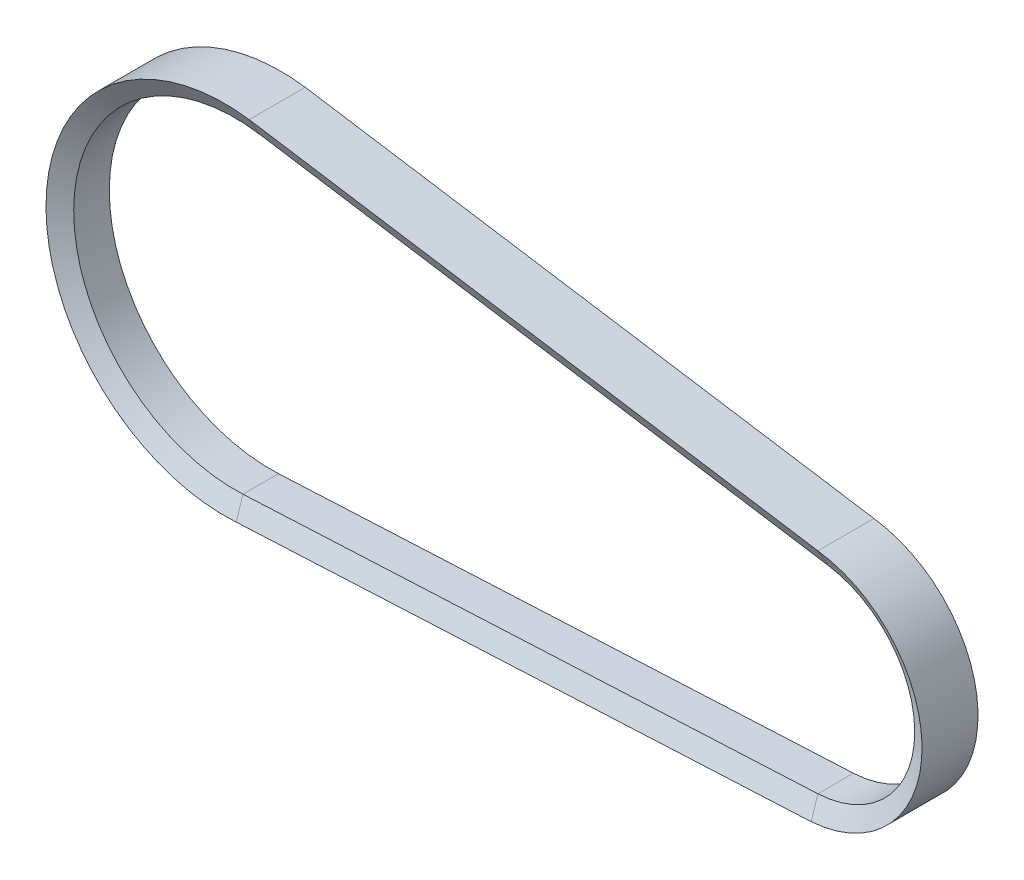
ISO-10303-21;
HEADER;
FILE_DESCRIPTION(('STEP AP214'),'2;1');
FILE_NAME('part.step','',(''),(''),'','','');
FILE_SCHEMA(('AUTOMOTIVE_DESIGN { 1 0 10303 214 1 1 1 1 }'));
ENDSEC;
DATA;
#1=APPLICATION_CONTEXT('core data for automotive mechanical design processes');
#2=APPLICATION_PROTOCOL_DEFINITION('international standard','automotive_design',2000,#1);
#3=PRODUCT_CONTEXT('',#1,'mechanical');
#4=PRODUCT('Part','Part','',(#3));
#5=PRODUCT_RELATED_PRODUCT_CATEGORY('part','',(#4));
#6=PRODUCT_DEFINITION_FORMATION('','',#4);
#7=PRODUCT_DEFINITION_CONTEXT('part definition',#1,'design');
#8=PRODUCT_DEFINITION('design','',#6,#7);
#9=PRODUCT_DEFINITION_SHAPE('','',#8);
#10=(LENGTH_UNIT() NAMED_UNIT(*) SI_UNIT(.MILLI.,.METRE.));
#11=(NAMED_UNIT(*) PLANE_ANGLE_UNIT() SI_UNIT($,.RADIAN.));
#12=(NAMED_UNIT(*) SI_UNIT($,.STERADIAN.) SOLID_ANGLE_UNIT());
#13=UNCERTAINTY_MEASURE_WITH_UNIT(LENGTH_MEASURE(1.E-05),#10,'distance_accuracy_value','');
#14=(GEOMETRIC_REPRESENTATION_CONTEXT(3) GLOBAL_UNCERTAINTY_ASSIGNED_CONTEXT((#13)) GLOBAL_UNIT_ASSIGNED_CONTEXT((#10,
#11,#12)) REPRESENTATION_CONTEXT('',''));
#15=CARTESIAN_POINT('',(0.,0.,0.));
#16=DIRECTION('',(0.,0.,1.));
#17=DIRECTION('',(1.,0.,0.));
#18=AXIS2_PLACEMENT_3D('',#15,#16,#17);
#19=CARTESIAN_POINT('',(0.,0.,0.));
#20=DIRECTION('',(0.,0.,-1.));
#21=DIRECTION('',(-1.,0.,0.));
#22=AXIS2_PLACEMENT_3D('',#19,#20,#21);
#23=CYLINDRICAL_SURFACE('',#22,54.6431790354136);
#24=DIRECTION('',(0.,0.,-1.));
#25=VECTOR('',#24,1.);
#26=CARTESIAN_POINT('',(2.76207245398682,-54.5733265511201,6.035));
#27=LINE('',#26,#25);
#28=CARTESIAN_POINT('',(2.76207245398682,-54.5733265511201,6.035));
#29=VERTEX_POINT('',#28);
#30=CARTESIAN_POINT('',(2.76207245398682,-54.5733265511201,-6.035));
#31=VERTEX_POINT('',#30);
#32=EDGE_CURVE('E219',#29,#31,#27,.T.);
#33=ORIENTED_EDGE('',*,*,#32,.T.);
#34=CARTESIAN_POINT('',(0.,0.,-6.035));
#35=DIRECTION('',(0.,0.,-1.));
#36=DIRECTION('',(-1.,0.,0.));
#37=AXIS2_PLACEMENT_3D('',#34,#35,#36);
#38=CIRCLE('',#37,54.6431790354136);
#39=CARTESIAN_POINT('',(8.35924728048283,54.,-6.035));
#40=VERTEX_POINT('',#39);
#41=EDGE_CURVE('E46',#31,#40,#38,.T.);
#42=ORIENTED_EDGE('',*,*,#41,.T.);
#43=CARTESIAN_POINT('',(8.35924728048282,54.,6.035));
#44=DIRECTION('',(0.,0.,-1.));
#45=VECTOR('',#44,1.);
#46=LINE('',#43,#45);
#47=CARTESIAN_POINT('',(8.35924728048356,53.9999999999999,6.035));
#48=VERTEX_POINT('',#47);
#49=EDGE_CURVE('E280',#48,#40,#46,.T.);
#50=ORIENTED_EDGE('',*,*,#49,.F.);
#51=CARTESIAN_POINT('',(0.,0.,6.035));
#52=DIRECTION('',(0.,0.,-1.));
#53=DIRECTION('',(-1.,0.,0.));
#54=AXIS2_PLACEMENT_3D('',#51,#52,#53);
#55=CIRCLE('',#54,54.6431790354136);
#56=EDGE_CURVE('E11',#29,#48,#55,.T.);
#57=ORIENTED_EDGE('',*,*,#56,.F.);
#58=EDGE_LOOP('',(#33,#42,#50,#57));
#59=FACE_BOUND('',#58,.T.);
#60=ADVANCED_FACE('F35',(#59),#23,.F.);
#61=DIRECTION('',(0.175574259871604,-0.848041083480355,-0.500000000000004));
#62=VECTOR('',#61,1.);
#63=CARTESIAN_POINT('',(2.76207245398682,-54.5733265511201,-6.035));
#64=LINE('',#63,#62);
#65=CARTESIAN_POINT('',(0.,0.,0.));
#66=DIRECTION('',(0.,0.,-1.));
#67=AXIS1_PLACEMENT('',#65,#66);
#68=SURFACE_OF_REVOLUTION('',#64,#67);
#69=CARTESIAN_POINT('',(3.97848660838251,-60.448727525095,-9.49910161513779));
#70=VERTEX_POINT('',#69);
#71=EDGE_CURVE('E215',#31,#70,#64,.T.);
#72=ORIENTED_EDGE('',*,*,#71,.T.);
#73=CARTESIAN_POINT('',(0.,0.,-9.49910161513779));
#74=DIRECTION('',(0.,0.,-1.));
#75=DIRECTION('',(-1.,0.,0.));
#76=AXIS2_PLACEMENT_3D('',#73,#74,#75);
#77=CIRCLE('',#76,60.5795098618028);
#78=CARTESIAN_POINT('',(8.35924728048283,60.,-9.49910161513779));
#79=VERTEX_POINT('',#78);
#80=EDGE_CURVE('E232',#70,#79,#77,.T.);
#81=ORIENTED_EDGE('',*,*,#80,.T.);
#82=CARTESIAN_POINT('',(8.35924728048362,59.9999999999999,-9.49910161513779));
#83=CARTESIAN_POINT('',(8.35924728048362,59.7499999999999,-9.35476404784038));
#84=CARTESIAN_POINT('',(8.35924728048362,59.4999999999999,-9.21042648054297));
#85=CARTESIAN_POINT('',(8.35924728048361,58.9999999999999,-8.92175134594815));
#86=CARTESIAN_POINT('',(8.3592472804836,58.7499999999999,-8.77741377865075));
#87=CARTESIAN_POINT('',(8.3592472804836,58.2499999999999,-8.48873864405593));
#88=CARTESIAN_POINT('',(8.35924728048359,57.9999999999999,-8.34440107675852));
#89=CARTESIAN_POINT('',(8.35924728048359,57.4999999999999,-8.05572594216371));
#90=CARTESIAN_POINT('',(8.35924728048358,57.2499999999999,-7.9113883748663));
#91=CARTESIAN_POINT('',(8.35924728048358,56.7499999999999,-7.62271324027148));
#92=CARTESIAN_POINT('',(8.35924728048357,56.4999999999999,-7.47837567297408));
#93=CARTESIAN_POINT('',(8.35924728048356,55.9999999999999,-7.18970053837926));
#94=CARTESIAN_POINT('',(8.35924728048356,55.7499999999999,-7.04536297108185));
#95=CARTESIAN_POINT('',(8.35924728048355,55.2499999999999,-6.75668783648703));
#96=CARTESIAN_POINT('',(8.35924728048355,54.9999999999999,-6.61235026918963));
#97=CARTESIAN_POINT('',(8.35924728048354,54.4999999999999,-6.32367513459481));
#98=CARTESIAN_POINT('',(8.35924728048354,54.2499999999999,-6.1793375672974));
#99=CARTESIAN_POINT('',(8.35924728048354,53.9999999999999,-6.03499999999999));
#100=B_SPLINE_CURVE_WITH_KNOTS('',3,(#82,#83,#84,#85,#86,#87,#88,#89,#90,#91,#92,#93,#94,#95,
#96,#97,#98,#99),.UNSPECIFIED.,.F.,.F.,(4,2,2,2,2,2,2,2,4),(0.,0.866025403784435,
1.73205080756888,2.59807621135332,3.46410161513775,4.33012701892221,5.19615242270664,
6.06217782649108,6.92820323027552),.UNSPECIFIED.);
#101=EDGE_CURVE('E249',#40,#79,#100,.F.);
#102=ORIENTED_EDGE('',*,*,#101,.F.);
#103=ORIENTED_EDGE('',*,*,#41,.F.);
#104=EDGE_LOOP('',(#72,#81,#102,#103));
#105=FACE_BOUND('',#104,.T.);
#106=ADVANCED_FACE('F221',(#105),#68,.F.);
#107=CARTESIAN_POINT('',(0.,0.,0.));
#108=DIRECTION('',(0.,0.,-1.));
#109=DIRECTION('',(-1.,0.,0.));
#110=AXIS2_PLACEMENT_3D('',#107,#108,#109);
#111=CYLINDRICAL_SURFACE('',#110,60.5795098618028);
#112=DIRECTION('',(0.,0.,1.));
#113=VECTOR('',#112,1.);
#114=CARTESIAN_POINT('',(3.97848660838251,-60.448727525095,-9.49910161513779));
#115=LINE('',#114,#113);
#116=CARTESIAN_POINT('',(3.97848660838251,-60.448727525095,9.49910161513779));
#117=VERTEX_POINT('',#116);
#118=EDGE_CURVE('E211',#70,#117,#115,.T.);
#119=ORIENTED_EDGE('',*,*,#118,.T.);
#120=CARTESIAN_POINT('',(0.,0.,9.49910161513779));
#121=DIRECTION('',(0.,0.,-1.));
#122=DIRECTION('',(-1.,0.,0.));
#123=AXIS2_PLACEMENT_3D('',#120,#121,#122);
#124=CIRCLE('',#123,60.5795098618028);
#125=CARTESIAN_POINT('',(8.35924728048364,59.9999999999999,9.49910161513779));
#126=VERTEX_POINT('',#125);
#127=EDGE_CURVE('E240',#117,#126,#124,.T.);
#128=ORIENTED_EDGE('',*,*,#127,.T.);
#129=CARTESIAN_POINT('',(8.35924728048282,60.,-9.49910161513779));
#130=DIRECTION('',(0.,0.,1.));
#131=VECTOR('',#130,1.);
#132=LINE('',#129,#131);
#133=EDGE_CURVE('E245',#79,#126,#132,.T.);
#134=ORIENTED_EDGE('',*,*,#133,.F.);
#135=ORIENTED_EDGE('',*,*,#80,.F.);
#136=EDGE_LOOP('',(#119,#128,#134,#135));
#137=FACE_BOUND('',#136,.T.);
#138=ADVANCED_FACE('F205',(#137),#111,.T.);
#139=DIRECTION('',(-0.175574259871604,0.848041083480355,-0.500000000000004));
#140=VECTOR('',#139,1.);
#141=CARTESIAN_POINT('',(3.97848660838251,-60.448727525095,9.49910161513779));
#142=LINE('',#141,#140);
#143=CARTESIAN_POINT('',(0.,0.,0.));
#144=DIRECTION('',(0.,0.,-1.));
#145=AXIS1_PLACEMENT('',#143,#144);
#146=SURFACE_OF_REVOLUTION('',#142,#145);
#147=EDGE_CURVE('E117',#117,#29,#142,.T.);
#148=ORIENTED_EDGE('',*,*,#147,.T.);
#149=ORIENTED_EDGE('',*,*,#56,.T.);
#150=CARTESIAN_POINT('',(8.35924728048353,53.9999999999999,6.035));
#151=CARTESIAN_POINT('',(8.35924728048354,54.2499999999999,6.1793375672974));
#152=CARTESIAN_POINT('',(8.35924728048354,54.4999999999999,6.32367513459481));
#153=CARTESIAN_POINT('',(8.35924728048354,54.9999999999999,6.61235026918963));
#154=CARTESIAN_POINT('',(8.35924728048355,55.2499999999999,6.75668783648704));
#155=CARTESIAN_POINT('',(8.35924728048355,55.7499999999999,7.04536297108185));
#156=CARTESIAN_POINT('',(8.35924728048356,55.9999999999999,7.18970053837926));
#157=CARTESIAN_POINT('',(8.35924728048357,56.4999999999999,7.47837567297408));
#158=CARTESIAN_POINT('',(8.35924728048357,56.7499999999999,7.62271324027148));
#159=CARTESIAN_POINT('',(8.35924728048358,57.2499999999999,7.9113883748663));
#160=CARTESIAN_POINT('',(8.35924728048358,57.4999999999999,8.05572594216371));
#161=CARTESIAN_POINT('',(8.35924728048359,57.9999999999999,8.34440107675852));
#162=CARTESIAN_POINT('',(8.35924728048359,58.2499999999999,8.48873864405593));
#163=CARTESIAN_POINT('',(8.3592472804836,58.7499999999999,8.77741377865075));
#164=CARTESIAN_POINT('',(8.3592472804836,58.9999999999999,8.92175134594815));
#165=CARTESIAN_POINT('',(8.35924728048361,59.4999999999999,9.21042648054297));
#166=CARTESIAN_POINT('',(8.35924728048361,59.7499999999999,9.35476404784038));
#167=CARTESIAN_POINT('',(8.35924728048361,59.9999999999999,9.49910161513779));
#168=B_SPLINE_CURVE_WITH_KNOTS('',3,(#150,#151,#152,#153,#154,#155,#156,#157,#158,#159,#160,
#161,#162,#163,#164,#165,#166,#167),.UNSPECIFIED.,.F.,.F.,(4,2,2,2,2,2,2,2,4),(0.,
0.866025403784435,1.73205080756887,2.59807621135332,3.46410161513776,4.3301270189222,
5.19615242270664,6.06217782649108,6.92820323027551),.UNSPECIFIED.);
#169=EDGE_CURVE('E54',#126,#48,#168,.F.);
#170=ORIENTED_EDGE('',*,*,#169,.F.);
#171=ORIENTED_EDGE('',*,*,#127,.F.);
#172=EDGE_LOOP('',(#148,#149,#170,#171));
#173=FACE_BOUND('',#172,.T.);
#174=ADVANCED_FACE('F200',(#173),#146,.F.);
#175=CARTESIAN_POINT('',(197.782936263984,-45.0634217810336,6.035));
#176=DIRECTION('',(-0.0487056512644904,0.998813175491244,0.));
#177=DIRECTION('',(-0.998813175491244,-0.0487056512644904,0.));
#178=AXIS2_PLACEMENT_3D('',#175,#176,#177);
#179=PLANE('',#178);
#180=DIRECTION('',(0.,0.,-1.));
#181=VECTOR('',#180,1.);
#182=CARTESIAN_POINT('',(197.782936263984,-45.0634217810336,6.035));
#183=LINE('',#182,#181);
#184=CARTESIAN_POINT('',(197.782936263984,-45.0634217810336,6.035));
#185=VERTEX_POINT('',#184);
#186=CARTESIAN_POINT('',(197.782936263984,-45.0634217810336,-6.035));
#187=VERTEX_POINT('',#186);
#188=EDGE_CURVE('E114',#185,#187,#183,.T.);
#189=ORIENTED_EDGE('',*,*,#188,.T.);
#190=DIRECTION('',(-0.998813175491243,-0.0487056512644904,0.));
#191=VECTOR('',#190,1.);
#192=CARTESIAN_POINT('',(197.782936263984,-45.0634217810336,-6.035));
#193=LINE('',#192,#191);
#194=EDGE_CURVE('E265',#187,#31,#193,.T.);
#195=ORIENTED_EDGE('',*,*,#194,.T.);
#196=ORIENTED_EDGE('',*,*,#32,.F.);
#197=DIRECTION('',(-0.998813175491243,-0.0487056512644904,0.));
#198=VECTOR('',#197,1.);
#199=CARTESIAN_POINT('',(197.782936263984,-45.0634217810336,6.035));
#200=LINE('',#199,#198);
#201=EDGE_CURVE('E267',#185,#29,#200,.T.);
#202=ORIENTED_EDGE('',*,*,#201,.F.);
#203=EDGE_LOOP('',(#189,#195,#196,#202));
#204=FACE_BOUND('',#203,.T.);
#205=ADVANCED_FACE('F196',(#204),#179,.T.);
#206=CARTESIAN_POINT('',(197.782936263984,-45.0634217810336,-6.035));
#207=DIRECTION('',(-0.0245746607230567,0.503955789034105,-0.863379782453446));
#208=DIRECTION('',(0.,0.863640604142021,0.504108030958846));
#209=AXIS2_PLACEMENT_3D('',#206,#207,#208);
#210=PLANE('',#209);
#211=DIRECTION('',(0.175574259871604,-0.848041083480355,-0.500000000000004));
#212=VECTOR('',#211,1.);
#213=CARTESIAN_POINT('',(197.782936263984,-45.0634217810336,-6.035));
#214=LINE('',#213,#212);
#215=CARTESIAN_POINT('',(198.99935041838,-50.9388227550085,-9.49910161513779));
#216=VERTEX_POINT('',#215);
#217=EDGE_CURVE('E263',#187,#216,#214,.T.);
#218=ORIENTED_EDGE('',*,*,#217,.T.);
#219=DIRECTION('',(-0.998813175491243,-0.0487056512644904,0.));
#220=VECTOR('',#219,1.);
#221=CARTESIAN_POINT('',(198.99935041838,-50.9388227550085,-9.49910161513779));
#222=LINE('',#221,#220);
#223=EDGE_CURVE('E258',#216,#70,#222,.T.);
#224=ORIENTED_EDGE('',*,*,#223,.T.);
#225=ORIENTED_EDGE('',*,*,#71,.F.);
#226=ORIENTED_EDGE('',*,*,#194,.F.);
#227=EDGE_LOOP('',(#218,#224,#225,#226));
#228=FACE_BOUND('',#227,.T.);
#229=ADVANCED_FACE('F192',(#228),#210,.T.);
#230=CARTESIAN_POINT('',(198.99935041838,-50.9388227550085,-9.49910161513779));
#231=DIRECTION('',(0.0487056512644904,-0.998813175491244,0.));
#232=DIRECTION('',(0.998813175491244,0.0487056512644904,0.));
#233=AXIS2_PLACEMENT_3D('',#230,#231,#232);
#234=PLANE('',#233);
#235=DIRECTION('',(0.,0.,1.));
#236=VECTOR('',#235,1.);
#237=CARTESIAN_POINT('',(198.99935041838,-50.9388227550085,-9.49910161513779));
#238=LINE('',#237,#236);
#239=CARTESIAN_POINT('',(198.99935041838,-50.9388227550085,9.49910161513779));
#240=VERTEX_POINT('',#239);
#241=EDGE_CURVE('E140',#216,#240,#238,.T.);
#242=ORIENTED_EDGE('',*,*,#241,.T.);
#243=DIRECTION('',(-0.998813175491243,-0.0487056512644904,0.));
#244=VECTOR('',#243,1.);
#245=CARTESIAN_POINT('',(198.99935041838,-50.9388227550085,9.49910161513779));
#246=LINE('',#245,#244);
#247=EDGE_CURVE('E260',#240,#117,#246,.T.);
#248=ORIENTED_EDGE('',*,*,#247,.T.);
#249=ORIENTED_EDGE('',*,*,#118,.F.);
#250=ORIENTED_EDGE('',*,*,#223,.F.);
#251=EDGE_LOOP('',(#242,#248,#249,#250));
#252=FACE_BOUND('',#251,.T.);
#253=ADVANCED_FACE('F188',(#252),#234,.T.);
#254=CARTESIAN_POINT('',(198.99935041838,-50.9388227550085,9.49910161513779));
#255=DIRECTION('',(-0.0245746607230567,0.503955789034105,0.863379782453445));
#256=DIRECTION('',(0.,-0.863640604142021,0.504108030958846));
#257=AXIS2_PLACEMENT_3D('',#254,#255,#256);
#258=PLANE('',#257);
#259=DIRECTION('',(-0.175574259871604,0.848041083480355,-0.500000000000004));
#260=VECTOR('',#259,1.);
#261=CARTESIAN_POINT('',(198.99935041838,-50.9388227550085,9.49910161513779));
#262=LINE('',#261,#260);
#263=EDGE_CURVE('E137',#240,#185,#262,.T.);
#264=ORIENTED_EDGE('',*,*,#263,.T.);
#265=ORIENTED_EDGE('',*,*,#201,.T.);
#266=ORIENTED_EDGE('',*,*,#147,.F.);
#267=ORIENTED_EDGE('',*,*,#247,.F.);
#268=EDGE_LOOP('',(#264,#265,#266,#267));
#269=FACE_BOUND('',#268,.T.);
#270=ADVANCED_FACE('F185',(#269),#258,.T.);
#271=CARTESIAN_POINT('',(195.994976835287,-10.4663587397384,0.));
#272=DIRECTION('',(0.,0.,-1.));
#273=DIRECTION('',(-1.,0.,0.));
#274=AXIS2_PLACEMENT_3D('',#271,#272,#273);
#275=CYLINDRICAL_SURFACE('',#274,34.6432326725151);
#276=DIRECTION('',(0.,0.,-1.));
#277=VECTOR('',#276,1.);
#278=CARTESIAN_POINT('',(201.25820660448,23.7747274346035,6.035));
#279=LINE('',#278,#277);
#280=CARTESIAN_POINT('',(201.25820660448,23.7747274346035,6.035));
#281=VERTEX_POINT('',#280);
#282=CARTESIAN_POINT('',(201.25820660448,23.7747274346035,-6.035));
#283=VERTEX_POINT('',#282);
#284=EDGE_CURVE('E111',#281,#283,#279,.T.);
#285=ORIENTED_EDGE('',*,*,#284,.T.);
#286=CARTESIAN_POINT('',(195.994976835287,-10.4663587397384,-6.035));
#287=DIRECTION('',(0.,0.,-1.));
#288=DIRECTION('',(-1.,0.,0.));
#289=AXIS2_PLACEMENT_3D('',#286,#287,#288);
#290=CIRCLE('',#289,34.6432326725151);
#291=EDGE_CURVE('E118',#283,#187,#290,.T.);
#292=ORIENTED_EDGE('',*,*,#291,.T.);
#293=ORIENTED_EDGE('',*,*,#188,.F.);
#294=CARTESIAN_POINT('',(195.994976835287,-10.4663587397384,6.035));
#295=DIRECTION('',(0.,0.,-1.));
#296=DIRECTION('',(-1.,0.,0.));
#297=AXIS2_PLACEMENT_3D('',#294,#295,#296);
#298=CIRCLE('',#297,34.6432326725151);
#299=EDGE_CURVE('E106',#281,#185,#298,.T.);
#300=ORIENTED_EDGE('',*,*,#299,.F.);
#301=EDGE_LOOP('',(#285,#292,#293,#300));
#302=FACE_BOUND('',#301,.T.);
#303=ADVANCED_FACE('F108',(#302),#275,.F.);
#304=DIRECTION('',(0.,0.866025403784436,-0.500000000000004));
#305=VECTOR('',#304,1.);
#306=CARTESIAN_POINT('',(201.25820660448,23.7747274346035,-6.035));
#307=LINE('',#306,#305);
#308=CARTESIAN_POINT('',(195.994976835287,-10.4663587397384,0.));
#309=DIRECTION('',(0.,0.,-1.));
#310=AXIS1_PLACEMENT('',#308,#309);
#311=SURFACE_OF_REVOLUTION('',#307,#310);
#312=CARTESIAN_POINT('',(201.25820660448,29.7747274346035,-9.49910161513779));
#313=VERTEX_POINT('',#312);
#314=EDGE_CURVE('E134',#283,#313,#307,.T.);
#315=ORIENTED_EDGE('',*,*,#314,.T.);
#316=CARTESIAN_POINT('',(195.994976835287,-10.4663587397384,-9.49910161513779));
#317=DIRECTION('',(0.,0.,-1.));
#318=DIRECTION('',(-1.,0.,0.));
#319=AXIS2_PLACEMENT_3D('',#316,#317,#318);
#320=CIRCLE('',#319,40.5838219503058);
#321=EDGE_CURVE('E300',#313,#216,#320,.T.);
#322=ORIENTED_EDGE('',*,*,#321,.T.);
#323=ORIENTED_EDGE('',*,*,#217,.F.);
#324=ORIENTED_EDGE('',*,*,#291,.F.);
#325=EDGE_LOOP('',(#315,#322,#323,#324));
#326=FACE_BOUND('',#325,.T.);
#327=ADVANCED_FACE('F179',(#326),#311,.F.);
#328=CARTESIAN_POINT('',(195.994976835287,-10.4663587397384,0.));
#329=DIRECTION('',(0.,0.,-1.));
#330=DIRECTION('',(-1.,0.,0.));
#331=AXIS2_PLACEMENT_3D('',#328,#329,#330);
#332=CYLINDRICAL_SURFACE('',#331,40.5838219503058);
#333=DIRECTION('',(0.,0.,1.));
#334=VECTOR('',#333,1.);
#335=CARTESIAN_POINT('',(201.25820660448,29.7747274346035,-9.49910161513779));
#336=LINE('',#335,#334);
#337=CARTESIAN_POINT('',(201.25820660448,29.7747274346035,9.49910161513779));
#338=VERTEX_POINT('',#337);
#339=EDGE_CURVE('E178',#313,#338,#336,.T.);
#340=ORIENTED_EDGE('',*,*,#339,.T.);
#341=CARTESIAN_POINT('',(195.994976835287,-10.4663587397384,9.49910161513779));
#342=DIRECTION('',(0.,0.,-1.));
#343=DIRECTION('',(-1.,0.,0.));
#344=AXIS2_PLACEMENT_3D('',#341,#342,#343);
#345=CIRCLE('',#344,40.5838219503058);
#346=EDGE_CURVE('E124',#338,#240,#345,.T.);
#347=ORIENTED_EDGE('',*,*,#346,.T.);
#348=ORIENTED_EDGE('',*,*,#241,.F.);
#349=ORIENTED_EDGE('',*,*,#321,.F.);
#350=EDGE_LOOP('',(#340,#347,#348,#349));
#351=FACE_BOUND('',#350,.T.);
#352=ADVANCED_FACE('F171',(#351),#332,.T.);
#353=DIRECTION('',(0.,-0.866025403784436,-0.500000000000004));
#354=VECTOR('',#353,1.);
#355=CARTESIAN_POINT('',(201.25820660448,29.7747274346035,9.49910161513779));
#356=LINE('',#355,#354);
#357=CARTESIAN_POINT('',(195.994976835287,-10.4663587397384,0.));
#358=DIRECTION('',(0.,0.,-1.));
#359=AXIS1_PLACEMENT('',#357,#358);
#360=SURFACE_OF_REVOLUTION('',#356,#359);
#361=EDGE_CURVE('E121',#338,#281,#356,.T.);
#362=ORIENTED_EDGE('',*,*,#361,.T.);
#363=ORIENTED_EDGE('',*,*,#299,.T.);
#364=ORIENTED_EDGE('',*,*,#263,.F.);
#365=ORIENTED_EDGE('',*,*,#346,.F.);
#366=EDGE_LOOP('',(#362,#363,#364,#365));
#367=FACE_BOUND('',#366,.T.);
#368=ADVANCED_FACE('F122',(#367),#360,.F.);
#369=CARTESIAN_POINT('',(201.25820660448,29.7747274346035,9.49910161513779));
#370=DIRECTION('',(0.0781054949038969,0.498472549812383,-0.863379782453445));
#371=DIRECTION('',(0.,0.866025403784436,0.500000000000004));
#372=AXIS2_PLACEMENT_3D('',#369,#370,#371);
#373=PLANE('',#372);
#374=ORIENTED_EDGE('',*,*,#169,.T.);
#375=DIRECTION('',(-0.987945691282909,0.154800875564497,0.));
#376=VECTOR('',#375,1.);
#377=CARTESIAN_POINT('',(201.25820660448,23.7747274346035,6.035));
#378=LINE('',#377,#376);
#379=EDGE_CURVE('E129',#281,#48,#378,.T.);
#380=ORIENTED_EDGE('',*,*,#379,.F.);
#381=ORIENTED_EDGE('',*,*,#361,.F.);
#382=DIRECTION('',(-0.987945691282909,0.154800875564497,0.));
#383=VECTOR('',#382,1.);
#384=CARTESIAN_POINT('',(201.25820660448,29.7747274346035,9.49910161513779));
#385=LINE('',#384,#383);
#386=EDGE_CURVE('E156',#338,#126,#385,.T.);
#387=ORIENTED_EDGE('',*,*,#386,.T.);
#388=EDGE_LOOP('',(#374,#380,#381,#387));
#389=FACE_BOUND('',#388,.T.);
#390=ADVANCED_FACE('F136',(#389),#373,.F.);
#391=CARTESIAN_POINT('',(201.25820660448,23.7747274346035,6.035));
#392=DIRECTION('',(0.154800875564497,0.987945691282909,0.));
#393=DIRECTION('',(-0.987945691282909,0.154800875564497,0.));
#394=AXIS2_PLACEMENT_3D('',#391,#392,#393);
#395=PLANE('',#394);
#396=ORIENTED_EDGE('',*,*,#49,.T.);
#397=DIRECTION('',(-0.987945691282909,0.154800875564497,0.));
#398=VECTOR('',#397,1.);
#399=CARTESIAN_POINT('',(201.25820660448,23.7747274346035,-6.035));
#400=LINE('',#399,#398);
#401=EDGE_CURVE('E132',#283,#40,#400,.T.);
#402=ORIENTED_EDGE('',*,*,#401,.F.);
#403=ORIENTED_EDGE('',*,*,#284,.F.);
#404=ORIENTED_EDGE('',*,*,#379,.T.);
#405=EDGE_LOOP('',(#396,#402,#403,#404));
#406=FACE_BOUND('',#405,.T.);
#407=ADVANCED_FACE('F128',(#406),#395,.F.);
#408=CARTESIAN_POINT('',(201.25820660448,23.7747274346035,-6.035));
#409=DIRECTION('',(0.0781054949038968,0.498472549812383,0.863379782453446));
#410=DIRECTION('',(0.,-0.866025403784436,0.500000000000004));
#411=AXIS2_PLACEMENT_3D('',#408,#409,#410);
#412=PLANE('',#411);
#413=ORIENTED_EDGE('',*,*,#101,.T.);
#414=DIRECTION('',(-0.987945691282909,0.154800875564497,0.));
#415=VECTOR('',#414,1.);
#416=CARTESIAN_POINT('',(201.25820660448,29.7747274346035,-9.49910161513779));
#417=LINE('',#416,#415);
#418=EDGE_CURVE('E142',#313,#79,#417,.T.);
#419=ORIENTED_EDGE('',*,*,#418,.F.);
#420=ORIENTED_EDGE('',*,*,#314,.F.);
#421=ORIENTED_EDGE('',*,*,#401,.T.);
#422=EDGE_LOOP('',(#413,#419,#420,#421));
#423=FACE_BOUND('',#422,.T.);
#424=ADVANCED_FACE('F308',(#423),#412,.F.);
#425=CARTESIAN_POINT('',(201.25820660448,29.7747274346035,-9.49910161513779));
#426=DIRECTION('',(-0.154800875564497,-0.987945691282909,0.));
#427=DIRECTION('',(0.987945691282909,-0.154800875564497,0.));
#428=AXIS2_PLACEMENT_3D('',#425,#426,#427);
#429=PLANE('',#428);
#430=ORIENTED_EDGE('',*,*,#133,.T.);
#431=ORIENTED_EDGE('',*,*,#386,.F.);
#432=ORIENTED_EDGE('',*,*,#339,.F.);
#433=ORIENTED_EDGE('',*,*,#418,.T.);
#434=EDGE_LOOP('',(#430,#431,#432,#433));
#435=FACE_BOUND('',#434,.T.);
#436=ADVANCED_FACE('F311',(#435),#429,.F.);
#437=CLOSED_SHELL('',(#60,#106,#138,#174,#205,#229,#253,#270,#303,#327,#352,#368,#390,#407,#424,#436));
#438=MANIFOLD_SOLID_BREP('B2',#437);
#439=ADVANCED_BREP_SHAPE_REPRESENTATION('',(#18,#438),#14);
#440=SHAPE_DEFINITION_REPRESENTATION(#9,#439);
ENDSEC;
END-ISO-10303-21;
